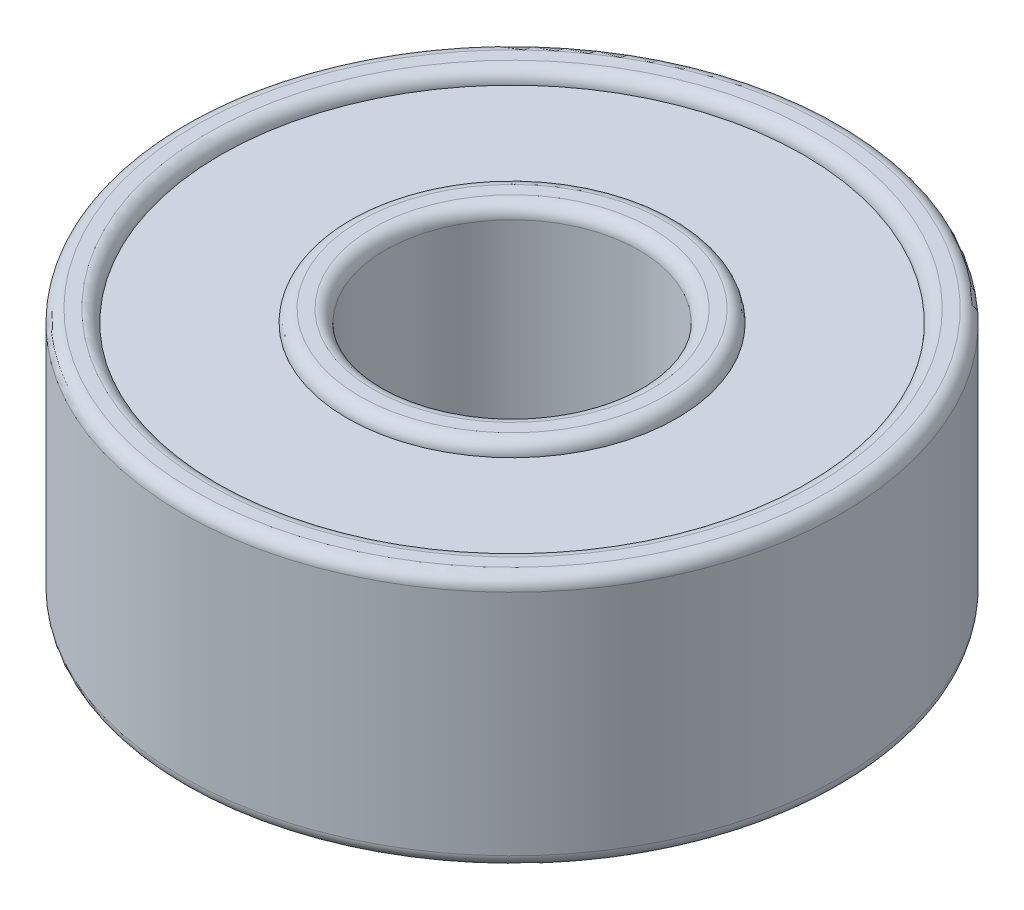
ISO-10303-21;
HEADER;
FILE_DESCRIPTION(('STEP AP214'),'2;1');
FILE_NAME('part.step','',(''),(''),'','','');
FILE_SCHEMA(('AUTOMOTIVE_DESIGN { 1 0 10303 214 1 1 1 1 }'));
ENDSEC;
DATA;
#1=APPLICATION_CONTEXT('core data for automotive mechanical design processes');
#2=APPLICATION_PROTOCOL_DEFINITION('international standard','automotive_design',2000,#1);
#3=PRODUCT_CONTEXT('',#1,'mechanical');
#4=PRODUCT('Part','Part','',(#3));
#5=PRODUCT_RELATED_PRODUCT_CATEGORY('part','',(#4));
#6=PRODUCT_DEFINITION_FORMATION('','',#4);
#7=PRODUCT_DEFINITION_CONTEXT('part definition',#1,'design');
#8=PRODUCT_DEFINITION('design','',#6,#7);
#9=PRODUCT_DEFINITION_SHAPE('','',#8);
#10=(LENGTH_UNIT() NAMED_UNIT(*) SI_UNIT(.MILLI.,.METRE.));
#11=(NAMED_UNIT(*) PLANE_ANGLE_UNIT() SI_UNIT($,.RADIAN.));
#12=(NAMED_UNIT(*) SI_UNIT($,.STERADIAN.) SOLID_ANGLE_UNIT());
#13=UNCERTAINTY_MEASURE_WITH_UNIT(LENGTH_MEASURE(1.E-05),#10,'distance_accuracy_value','');
#14=(GEOMETRIC_REPRESENTATION_CONTEXT(3) GLOBAL_UNCERTAINTY_ASSIGNED_CONTEXT((#13)) GLOBAL_UNIT_ASSIGNED_CONTEXT((#10,
#11,#12)) REPRESENTATION_CONTEXT('',''));
#15=CARTESIAN_POINT('',(0.,0.,0.));
#16=DIRECTION('',(0.,0.,1.));
#17=DIRECTION('',(1.,0.,0.));
#18=AXIS2_PLACEMENT_3D('',#15,#16,#17);
#19=CARTESIAN_POINT('',(0.,-2.5,0.));
#20=DIRECTION('',(0.,1.,0.));
#21=DIRECTION('',(0.,0.,1.));
#22=AXIS2_PLACEMENT_3D('',#19,#20,#21);
#23=PLANE('',#22);
#24=CARTESIAN_POINT('',(0.,-2.5,0.));
#25=DIRECTION('',(0.,1.,0.));
#26=DIRECTION('',(0.,0.,1.));
#27=AXIS2_PLACEMENT_3D('',#24,#25,#26);
#28=CIRCLE('',#27,3.);
#29=CARTESIAN_POINT('',(0.,-2.5,3.));
#30=VERTEX_POINT('',#29);
#31=EDGE_CURVE('E71',#30,#30,#28,.F.);
#32=ORIENTED_EDGE('',*,*,#31,.T.);
#33=EDGE_LOOP('',(#32));
#34=FACE_BOUND('',#33,.T.);
#35=CARTESIAN_POINT('',(0.,-2.5,0.));
#36=DIRECTION('',(0.,1.,0.));
#37=DIRECTION('',(0.,0.,1.));
#38=AXIS2_PLACEMENT_3D('',#35,#36,#37);
#39=CIRCLE('',#38,2.75);
#40=CARTESIAN_POINT('',(0.,-2.5,2.75));
#41=VERTEX_POINT('',#40);
#42=EDGE_CURVE('E74',#41,#41,#39,.T.);
#43=ORIENTED_EDGE('',*,*,#42,.T.);
#44=EDGE_LOOP('',(#43));
#45=FACE_BOUND('',#44,.T.);
#46=ADVANCED_FACE('F33',(#34,#45),#23,.F.);
#47=CARTESIAN_POINT('',(0.,2.5,0.));
#48=DIRECTION('',(0.,1.,0.));
#49=DIRECTION('',(0.,0.,1.));
#50=AXIS2_PLACEMENT_3D('',#47,#48,#49);
#51=PLANE('',#50);
#52=CARTESIAN_POINT('',(0.,2.5,0.));
#53=DIRECTION('',(0.,1.,0.));
#54=DIRECTION('',(0.,0.,1.));
#55=AXIS2_PLACEMENT_3D('',#52,#53,#54);
#56=CIRCLE('',#55,3.);
#57=CARTESIAN_POINT('',(0.,2.5,3.));
#58=VERTEX_POINT('',#57);
#59=EDGE_CURVE('E59',#58,#58,#56,.T.);
#60=ORIENTED_EDGE('',*,*,#59,.T.);
#61=EDGE_LOOP('',(#60));
#62=FACE_BOUND('',#61,.T.);
#63=CARTESIAN_POINT('',(0.,2.5,0.));
#64=DIRECTION('',(0.,1.,0.));
#65=DIRECTION('',(0.,0.,1.));
#66=AXIS2_PLACEMENT_3D('',#63,#64,#65);
#67=CIRCLE('',#66,2.75);
#68=CARTESIAN_POINT('',(0.,2.5,2.75));
#69=VERTEX_POINT('',#68);
#70=EDGE_CURVE('E62',#69,#69,#67,.F.);
#71=ORIENTED_EDGE('',*,*,#70,.T.);
#72=EDGE_LOOP('',(#71));
#73=FACE_BOUND('',#72,.T.);
#74=ADVANCED_FACE('F101',(#62,#73),#51,.T.);
#75=CARTESIAN_POINT('',(0.,2.5,0.));
#76=DIRECTION('',(0.,1.,0.));
#77=DIRECTION('',(0.,0.,1.));
#78=AXIS2_PLACEMENT_3D('',#75,#76,#77);
#79=CIRCLE('',#78,6.);
#80=CARTESIAN_POINT('',(0.,2.5,6.));
#81=VERTEX_POINT('',#80);
#82=EDGE_CURVE('E53',#81,#81,#79,.F.);
#83=ORIENTED_EDGE('',*,*,#82,.T.);
#84=EDGE_LOOP('',(#83));
#85=FACE_BOUND('',#84,.T.);
#86=CARTESIAN_POINT('',(0.,2.5,0.));
#87=DIRECTION('',(0.,1.,0.));
#88=DIRECTION('',(0.,0.,1.));
#89=AXIS2_PLACEMENT_3D('',#86,#87,#88);
#90=CIRCLE('',#89,6.25);
#91=CARTESIAN_POINT('',(0.,2.5,6.25));
#92=VERTEX_POINT('',#91);
#93=EDGE_CURVE('E56',#92,#92,#90,.T.);
#94=ORIENTED_EDGE('',*,*,#93,.T.);
#95=EDGE_LOOP('',(#94));
#96=FACE_BOUND('',#95,.T.);
#97=ADVANCED_FACE('F135',(#85,#96),#51,.T.);
#98=CARTESIAN_POINT('',(0.,-2.5,0.));
#99=DIRECTION('',(0.,1.,0.));
#100=DIRECTION('',(0.,0.,1.));
#101=AXIS2_PLACEMENT_3D('',#98,#99,#100);
#102=CIRCLE('',#101,6.);
#103=CARTESIAN_POINT('',(0.,-2.5,6.));
#104=VERTEX_POINT('',#103);
#105=EDGE_CURVE('E65',#104,#104,#102,.T.);
#106=ORIENTED_EDGE('',*,*,#105,.T.);
#107=EDGE_LOOP('',(#106));
#108=FACE_BOUND('',#107,.T.);
#109=CARTESIAN_POINT('',(0.,-2.5,0.));
#110=DIRECTION('',(0.,1.,0.));
#111=DIRECTION('',(0.,0.,1.));
#112=AXIS2_PLACEMENT_3D('',#109,#110,#111);
#113=CIRCLE('',#112,6.25);
#114=CARTESIAN_POINT('',(0.,-2.5,6.25));
#115=VERTEX_POINT('',#114);
#116=EDGE_CURVE('E68',#115,#115,#113,.F.);
#117=ORIENTED_EDGE('',*,*,#116,.T.);
#118=EDGE_LOOP('',(#117));
#119=FACE_BOUND('',#118,.T.);
#120=ADVANCED_FACE('F103',(#108,#119),#23,.F.);
#121=CARTESIAN_POINT('',(0.,2.5,0.));
#122=DIRECTION('',(0.,-1.,0.));
#123=DIRECTION('',(0.,0.,-1.));
#124=AXIS2_PLACEMENT_3D('',#121,#122,#123);
#125=CYLINDRICAL_SURFACE('',#124,6.5);
#126=CARTESIAN_POINT('',(0.,-2.25,0.));
#127=DIRECTION('',(0.,1.,0.));
#128=DIRECTION('',(0.,0.,1.));
#129=AXIS2_PLACEMENT_3D('',#126,#127,#128);
#130=CIRCLE('',#129,6.5);
#131=CARTESIAN_POINT('',(0.,-2.25,6.5));
#132=VERTEX_POINT('',#131);
#133=EDGE_CURVE('E10',#132,#132,#130,.T.);
#134=ORIENTED_EDGE('',*,*,#133,.T.);
#135=EDGE_LOOP('',(#134));
#136=FACE_BOUND('',#135,.T.);
#137=CARTESIAN_POINT('',(0.,2.25,0.));
#138=DIRECTION('',(0.,1.,0.));
#139=DIRECTION('',(0.,0.,1.));
#140=AXIS2_PLACEMENT_3D('',#137,#138,#139);
#141=CIRCLE('',#140,6.5);
#142=CARTESIAN_POINT('',(0.,2.25,6.5));
#143=VERTEX_POINT('',#142);
#144=EDGE_CURVE('E40',#143,#143,#141,.F.);
#145=ORIENTED_EDGE('',*,*,#144,.T.);
#146=EDGE_LOOP('',(#145));
#147=FACE_BOUND('',#146,.T.);
#148=ADVANCED_FACE('F134',(#136,#147),#125,.T.);
#149=CARTESIAN_POINT('',(0.,2.5,0.));
#150=DIRECTION('',(0.,-1.,0.));
#151=DIRECTION('',(0.,0.,-1.));
#152=AXIS2_PLACEMENT_3D('',#149,#150,#151);
#153=CYLINDRICAL_SURFACE('',#152,2.5);
#154=CARTESIAN_POINT('',(0.,-2.25,0.));
#155=DIRECTION('',(0.,1.,0.));
#156=DIRECTION('',(0.,0.,1.));
#157=AXIS2_PLACEMENT_3D('',#154,#155,#156);
#158=CIRCLE('',#157,2.5);
#159=CARTESIAN_POINT('',(0.,-2.25,2.5));
#160=VERTEX_POINT('',#159);
#161=EDGE_CURVE('E44',#160,#160,#158,.F.);
#162=ORIENTED_EDGE('',*,*,#161,.T.);
#163=EDGE_LOOP('',(#162));
#164=FACE_BOUND('',#163,.T.);
#165=CARTESIAN_POINT('',(0.,2.25,0.));
#166=DIRECTION('',(0.,1.,0.));
#167=DIRECTION('',(0.,0.,1.));
#168=AXIS2_PLACEMENT_3D('',#165,#166,#167);
#169=CIRCLE('',#168,2.5);
#170=CARTESIAN_POINT('',(0.,2.25,2.5));
#171=VERTEX_POINT('',#170);
#172=EDGE_CURVE('E48',#171,#171,#169,.T.);
#173=ORIENTED_EDGE('',*,*,#172,.T.);
#174=EDGE_LOOP('',(#173));
#175=FACE_BOUND('',#174,.T.);
#176=ADVANCED_FACE('F141',(#164,#175),#153,.F.);
#177=CARTESIAN_POINT('',(0.,2.25,0.));
#178=DIRECTION('',(0.,1.,0.));
#179=DIRECTION('',(0.,0.,1.));
#180=AXIS2_PLACEMENT_3D('',#177,#178,#179);
#181=PLANE('',#180);
#182=CARTESIAN_POINT('',(0.,2.25,0.));
#183=DIRECTION('',(0.,1.,0.));
#184=DIRECTION('',(0.,0.,1.));
#185=AXIS2_PLACEMENT_3D('',#182,#183,#184);
#186=CIRCLE('',#185,3.25);
#187=CARTESIAN_POINT('',(0.,2.25,3.25));
#188=VERTEX_POINT('',#187);
#189=EDGE_CURVE('E80',#188,#188,#186,.T.);
#190=ORIENTED_EDGE('',*,*,#189,.F.);
#191=EDGE_LOOP('',(#190));
#192=FACE_BOUND('',#191,.T.);
#193=CARTESIAN_POINT('',(0.,2.25,0.));
#194=DIRECTION('',(0.,1.,0.));
#195=DIRECTION('',(0.,0.,1.));
#196=AXIS2_PLACEMENT_3D('',#193,#194,#195);
#197=CIRCLE('',#196,5.75);
#198=CARTESIAN_POINT('',(0.,2.25,5.75));
#199=VERTEX_POINT('',#198);
#200=EDGE_CURVE('E77',#199,#199,#197,.T.);
#201=ORIENTED_EDGE('',*,*,#200,.T.);
#202=EDGE_LOOP('',(#201));
#203=FACE_BOUND('',#202,.T.);
#204=ADVANCED_FACE('F164',(#192,#203),#181,.T.);
#205=CARTESIAN_POINT('',(0.,-2.25,0.));
#206=DIRECTION('',(0.,-1.,0.));
#207=DIRECTION('',(0.,0.,1.));
#208=AXIS2_PLACEMENT_3D('',#205,#206,#207);
#209=PLANE('',#208);
#210=CARTESIAN_POINT('',(0.,-2.25,0.));
#211=DIRECTION('',(0.,1.,0.));
#212=DIRECTION('',(0.,0.,1.));
#213=AXIS2_PLACEMENT_3D('',#210,#211,#212);
#214=CIRCLE('',#213,5.75);
#215=CARTESIAN_POINT('',(0.,-2.25,5.75));
#216=VERTEX_POINT('',#215);
#217=EDGE_CURVE('E83',#216,#216,#214,.T.);
#218=ORIENTED_EDGE('',*,*,#217,.F.);
#219=EDGE_LOOP('',(#218));
#220=FACE_BOUND('',#219,.T.);
#221=CARTESIAN_POINT('',(0.,-2.25,0.));
#222=DIRECTION('',(0.,1.,0.));
#223=DIRECTION('',(0.,0.,1.));
#224=AXIS2_PLACEMENT_3D('',#221,#222,#223);
#225=CIRCLE('',#224,3.25);
#226=CARTESIAN_POINT('',(0.,-2.25,3.25));
#227=VERTEX_POINT('',#226);
#228=EDGE_CURVE('E86',#227,#227,#225,.T.);
#229=ORIENTED_EDGE('',*,*,#228,.T.);
#230=EDGE_LOOP('',(#229));
#231=FACE_BOUND('',#230,.T.);
#232=ADVANCED_FACE('F90',(#220,#231),#209,.T.);
#233=CARTESIAN_POINT('',(0.,-2.25,0.));
#234=DIRECTION('',(0.,1.,0.));
#235=DIRECTION('',(0.,0.,1.));
#236=AXIS2_PLACEMENT_3D('',#233,#234,#235);
#237=TOROIDAL_SURFACE('',#236,3.,0.25);
#238=ORIENTED_EDGE('',*,*,#228,.F.);
#239=EDGE_LOOP('',(#238));
#240=FACE_BOUND('',#239,.T.);
#241=ORIENTED_EDGE('',*,*,#31,.F.);
#242=EDGE_LOOP('',(#241));
#243=FACE_BOUND('',#242,.T.);
#244=ADVANCED_FACE('F92',(#240,#243),#237,.T.);
#245=CARTESIAN_POINT('',(0.,-2.25,0.));
#246=DIRECTION('',(0.,1.,0.));
#247=DIRECTION('',(0.,0.,1.));
#248=AXIS2_PLACEMENT_3D('',#245,#246,#247);
#249=TOROIDAL_SURFACE('',#248,6.,0.25);
#250=ORIENTED_EDGE('',*,*,#105,.F.);
#251=EDGE_LOOP('',(#250));
#252=FACE_BOUND('',#251,.T.);
#253=ORIENTED_EDGE('',*,*,#217,.T.);
#254=EDGE_LOOP('',(#253));
#255=FACE_BOUND('',#254,.T.);
#256=ADVANCED_FACE('F95',(#252,#255),#249,.T.);
#257=CARTESIAN_POINT('',(0.,2.25,0.));
#258=DIRECTION('',(0.,1.,0.));
#259=DIRECTION('',(0.,0.,1.));
#260=AXIS2_PLACEMENT_3D('',#257,#258,#259);
#261=TOROIDAL_SURFACE('',#260,3.,0.25);
#262=ORIENTED_EDGE('',*,*,#189,.T.);
#263=EDGE_LOOP('',(#262));
#264=FACE_BOUND('',#263,.T.);
#265=ORIENTED_EDGE('',*,*,#59,.F.);
#266=EDGE_LOOP('',(#265));
#267=FACE_BOUND('',#266,.T.);
#268=ADVANCED_FACE('F119',(#264,#267),#261,.T.);
#269=CARTESIAN_POINT('',(0.,2.25,0.));
#270=DIRECTION('',(0.,1.,0.));
#271=DIRECTION('',(0.,0.,1.));
#272=AXIS2_PLACEMENT_3D('',#269,#270,#271);
#273=TOROIDAL_SURFACE('',#272,6.,0.25);
#274=ORIENTED_EDGE('',*,*,#82,.F.);
#275=EDGE_LOOP('',(#274));
#276=FACE_BOUND('',#275,.T.);
#277=ORIENTED_EDGE('',*,*,#200,.F.);
#278=EDGE_LOOP('',(#277));
#279=FACE_BOUND('',#278,.T.);
#280=ADVANCED_FACE('F109',(#276,#279),#273,.T.);
#281=CARTESIAN_POINT('',(0.,-2.25,0.));
#282=DIRECTION('',(0.,1.,0.));
#283=DIRECTION('',(0.,0.,1.));
#284=AXIS2_PLACEMENT_3D('',#281,#282,#283);
#285=TOROIDAL_SURFACE('',#284,2.75,0.25);
#286=ORIENTED_EDGE('',*,*,#161,.F.);
#287=EDGE_LOOP('',(#286));
#288=FACE_BOUND('',#287,.T.);
#289=ORIENTED_EDGE('',*,*,#42,.F.);
#290=EDGE_LOOP('',(#289));
#291=FACE_BOUND('',#290,.T.);
#292=ADVANCED_FACE('F106',(#288,#291),#285,.T.);
#293=CARTESIAN_POINT('',(0.,2.25,0.));
#294=DIRECTION('',(0.,1.,0.));
#295=DIRECTION('',(0.,0.,1.));
#296=AXIS2_PLACEMENT_3D('',#293,#294,#295);
#297=TOROIDAL_SURFACE('',#296,2.75,0.25);
#298=ORIENTED_EDGE('',*,*,#70,.F.);
#299=EDGE_LOOP('',(#298));
#300=FACE_BOUND('',#299,.T.);
#301=ORIENTED_EDGE('',*,*,#172,.F.);
#302=EDGE_LOOP('',(#301));
#303=FACE_BOUND('',#302,.T.);
#304=ADVANCED_FACE('F108',(#300,#303),#297,.T.);
#305=CARTESIAN_POINT('',(0.,-2.25,0.));
#306=DIRECTION('',(0.,1.,0.));
#307=DIRECTION('',(0.,0.,1.));
#308=AXIS2_PLACEMENT_3D('',#305,#306,#307);
#309=TOROIDAL_SURFACE('',#308,6.25,0.25);
#310=ORIENTED_EDGE('',*,*,#116,.F.);
#311=EDGE_LOOP('',(#310));
#312=FACE_BOUND('',#311,.T.);
#313=ORIENTED_EDGE('',*,*,#133,.F.);
#314=EDGE_LOOP('',(#313));
#315=FACE_BOUND('',#314,.T.);
#316=ADVANCED_FACE('F116',(#312,#315),#309,.T.);
#317=CARTESIAN_POINT('',(0.,2.25,0.));
#318=DIRECTION('',(0.,1.,0.));
#319=DIRECTION('',(0.,0.,1.));
#320=AXIS2_PLACEMENT_3D('',#317,#318,#319);
#321=TOROIDAL_SURFACE('',#320,6.25,0.25);
#322=ORIENTED_EDGE('',*,*,#144,.F.);
#323=EDGE_LOOP('',(#322));
#324=FACE_BOUND('',#323,.T.);
#325=ORIENTED_EDGE('',*,*,#93,.F.);
#326=EDGE_LOOP('',(#325));
#327=FACE_BOUND('',#326,.T.);
#328=ADVANCED_FACE('F35',(#324,#327),#321,.T.);
#329=CLOSED_SHELL('',(#46,#74,#97,#120,#148,#176,#204,#232,#244,#256,#268,#280,#292,#304,#316,#328));
#330=MANIFOLD_SOLID_BREP('B2',#329);
#331=ADVANCED_BREP_SHAPE_REPRESENTATION('',(#18,#330),#14);
#332=SHAPE_DEFINITION_REPRESENTATION(#9,#331);
ENDSEC;
END-ISO-10303-21;
